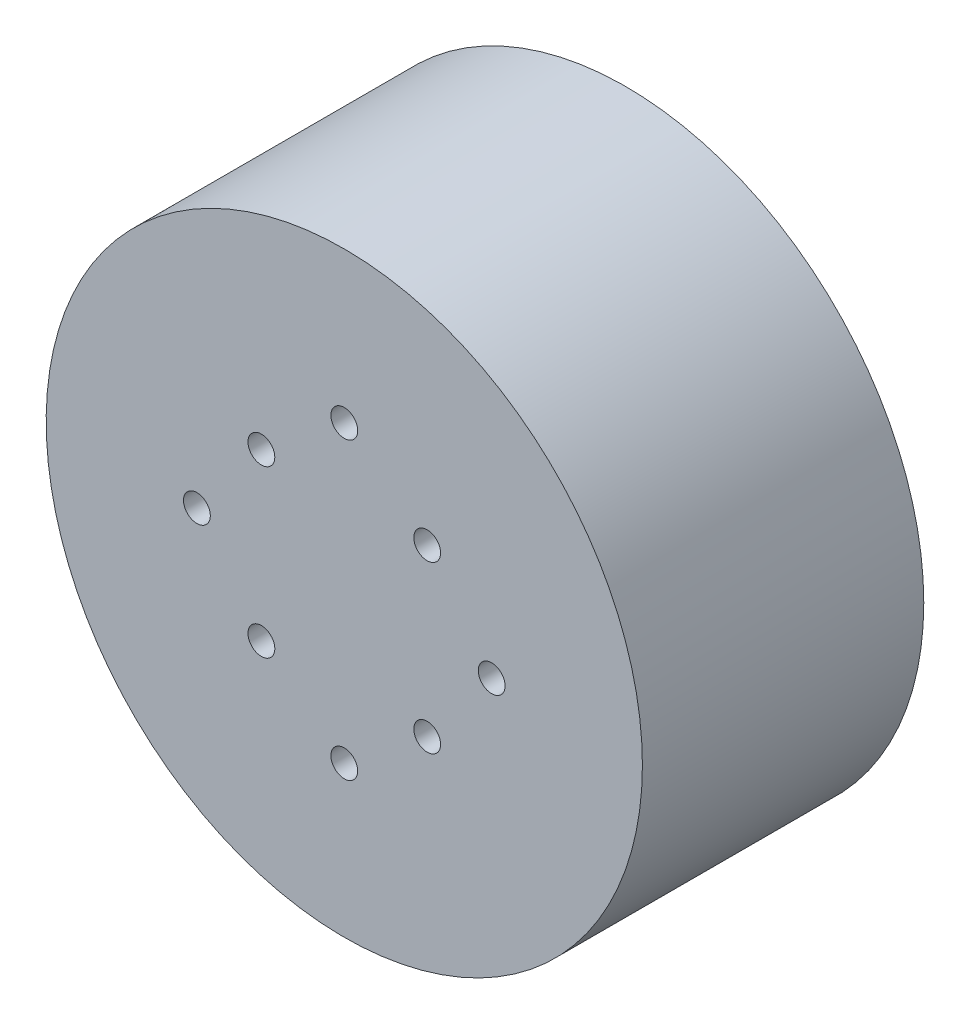
ISO-10303-21;
HEADER;
FILE_DESCRIPTION(('STEP AP214'),'2;1');
FILE_NAME('part.step','',(''),(''),'','','');
FILE_SCHEMA(('AUTOMOTIVE_DESIGN { 1 0 10303 214 1 1 1 1 }'));
ENDSEC;
DATA;
#1=APPLICATION_CONTEXT('core data for automotive mechanical design processes');
#2=APPLICATION_PROTOCOL_DEFINITION('international standard','automotive_design',2000,#1);
#3=PRODUCT_CONTEXT('',#1,'mechanical');
#4=PRODUCT('Part','Part','',(#3));
#5=PRODUCT_RELATED_PRODUCT_CATEGORY('part','',(#4));
#6=PRODUCT_DEFINITION_FORMATION('','',#4);
#7=PRODUCT_DEFINITION_CONTEXT('part definition',#1,'design');
#8=PRODUCT_DEFINITION('design','',#6,#7);
#9=PRODUCT_DEFINITION_SHAPE('','',#8);
#10=(LENGTH_UNIT() NAMED_UNIT(*) SI_UNIT(.MILLI.,.METRE.));
#11=(NAMED_UNIT(*) PLANE_ANGLE_UNIT() SI_UNIT($,.RADIAN.));
#12=(NAMED_UNIT(*) SI_UNIT($,.STERADIAN.) SOLID_ANGLE_UNIT());
#13=UNCERTAINTY_MEASURE_WITH_UNIT(LENGTH_MEASURE(1.E-05),#10,'distance_accuracy_value','');
#14=(GEOMETRIC_REPRESENTATION_CONTEXT(3) GLOBAL_UNCERTAINTY_ASSIGNED_CONTEXT((#13)) GLOBAL_UNIT_ASSIGNED_CONTEXT((#10,
#11,#12)) REPRESENTATION_CONTEXT('',''));
#15=CARTESIAN_POINT('',(0.,0.,0.));
#16=DIRECTION('',(0.,0.,1.));
#17=DIRECTION('',(1.,0.,0.));
#18=AXIS2_PLACEMENT_3D('',#15,#16,#17);
#19=CARTESIAN_POINT('',(0.,0.,42.));
#20=DIRECTION('',(0.,0.,-1.));
#21=DIRECTION('',(-1.,0.,0.));
#22=AXIS2_PLACEMENT_3D('',#19,#20,#21);
#23=CYLINDRICAL_SURFACE('',#22,44.5);
#24=CARTESIAN_POINT('',(0.,0.,42.));
#25=DIRECTION('',(0.,0.,1.));
#26=DIRECTION('',(1.,0.,0.));
#27=AXIS2_PLACEMENT_3D('',#24,#25,#26);
#28=CIRCLE('',#27,44.5);
#29=CARTESIAN_POINT('',(44.5,0.,42.));
#30=VERTEX_POINT('',#29);
#31=EDGE_CURVE('E223',#30,#30,#28,.T.);
#32=ORIENTED_EDGE('',*,*,#31,.F.);
#33=EDGE_LOOP('',(#32));
#34=FACE_BOUND('',#33,.T.);
#35=CARTESIAN_POINT('',(0.,0.,10.));
#36=DIRECTION('',(0.,0.,1.));
#37=DIRECTION('',(1.,0.,0.));
#38=AXIS2_PLACEMENT_3D('',#35,#36,#37);
#39=CIRCLE('',#38,44.5);
#40=CARTESIAN_POINT('',(-38.5046726518453,22.3078502768473,10.));
#41=VERTEX_POINT('',#40);
#42=CARTESIAN_POINT('',(-38.5046726518453,-22.3078502768473,10.));
#43=VERTEX_POINT('',#42);
#44=EDGE_CURVE('E11',#41,#43,#39,.T.);
#45=ORIENTED_EDGE('',*,*,#44,.T.);
#46=DIRECTION('',(0.,0.,-1.));
#47=VECTOR('',#46,1.);
#48=CARTESIAN_POINT('',(-38.5046726518453,-22.3078502768473,42.));
#49=LINE('',#48,#47);
#50=CARTESIAN_POINT('',(-38.5046726518453,-22.3078502768473,0.));
#51=VERTEX_POINT('',#50);
#52=EDGE_CURVE('E147',#43,#51,#49,.T.);
#53=ORIENTED_EDGE('',*,*,#52,.T.);
#54=CARTESIAN_POINT('',(0.,0.,0.));
#55=DIRECTION('',(0.,0.,1.));
#56=DIRECTION('',(1.,0.,0.));
#57=AXIS2_PLACEMENT_3D('',#54,#55,#56);
#58=CIRCLE('',#57,44.5);
#59=CARTESIAN_POINT('',(-38.5046726518453,22.3078502768473,0.));
#60=VERTEX_POINT('',#59);
#61=EDGE_CURVE('E222',#51,#60,#58,.T.);
#62=ORIENTED_EDGE('',*,*,#61,.T.);
#63=DIRECTION('',(0.,0.,-1.));
#64=VECTOR('',#63,1.);
#65=CARTESIAN_POINT('',(-38.5046726518453,22.3078502768473,42.));
#66=LINE('',#65,#64);
#67=EDGE_CURVE('E62',#60,#41,#66,.F.);
#68=ORIENTED_EDGE('',*,*,#67,.T.);
#69=EDGE_LOOP('',(#45,#53,#62,#68));
#70=FACE_BOUND('',#69,.T.);
#71=ADVANCED_FACE('F40',(#34,#70),#23,.T.);
#72=CARTESIAN_POINT('',(0.,0.,42.));
#73=DIRECTION('',(0.,0.,1.));
#74=DIRECTION('',(1.,0.,0.));
#75=AXIS2_PLACEMENT_3D('',#72,#73,#74);
#76=PLANE('',#75);
#77=CARTESIAN_POINT('',(22.,0.,42.));
#78=DIRECTION('',(0.,0.,1.));
#79=DIRECTION('',(0.,-1.,0.));
#80=AXIS2_PLACEMENT_3D('',#77,#78,#79);
#81=CIRCLE('',#80,2.);
#82=CARTESIAN_POINT('',(22.,-2.00000000000008,42.));
#83=VERTEX_POINT('',#82);
#84=EDGE_CURVE('E155',#83,#83,#81,.T.);
#85=ORIENTED_EDGE('',*,*,#84,.F.);
#86=EDGE_LOOP('',(#85));
#87=FACE_BOUND('',#86,.T.);
#88=CARTESIAN_POINT('',(12.3743686707645,-12.3743686707646,42.));
#89=DIRECTION('',(0.,0.,1.));
#90=DIRECTION('',(0.,-1.,0.));
#91=AXIS2_PLACEMENT_3D('',#88,#89,#90);
#92=CIRCLE('',#91,2.);
#93=CARTESIAN_POINT('',(12.3743686707645,-14.3743686707646,42.));
#94=VERTEX_POINT('',#93);
#95=EDGE_CURVE('E161',#94,#94,#92,.T.);
#96=ORIENTED_EDGE('',*,*,#95,.F.);
#97=EDGE_LOOP('',(#96));
#98=FACE_BOUND('',#97,.T.);
#99=CARTESIAN_POINT('',(0.,-22.,42.));
#100=DIRECTION('',(0.,0.,1.));
#101=DIRECTION('',(-1.,0.,0.));
#102=AXIS2_PLACEMENT_3D('',#99,#100,#101);
#103=CIRCLE('',#102,2.);
#104=CARTESIAN_POINT('',(-2.,-22.,42.));
#105=VERTEX_POINT('',#104);
#106=EDGE_CURVE('E167',#105,#105,#103,.T.);
#107=ORIENTED_EDGE('',*,*,#106,.F.);
#108=EDGE_LOOP('',(#107));
#109=FACE_BOUND('',#108,.T.);
#110=CARTESIAN_POINT('',(-12.3743686707646,-12.3743686707646,42.));
#111=DIRECTION('',(0.,0.,1.));
#112=DIRECTION('',(-1.,0.,0.));
#113=AXIS2_PLACEMENT_3D('',#110,#111,#112);
#114=CIRCLE('',#113,2.);
#115=CARTESIAN_POINT('',(-14.3743686707646,-12.3743686707646,42.));
#116=VERTEX_POINT('',#115);
#117=EDGE_CURVE('E173',#116,#116,#114,.T.);
#118=ORIENTED_EDGE('',*,*,#117,.F.);
#119=EDGE_LOOP('',(#118));
#120=FACE_BOUND('',#119,.T.);
#121=CARTESIAN_POINT('',(-22.,2.30437768363647E-13,42.));
#122=DIRECTION('',(0.,0.,1.));
#123=DIRECTION('',(0.,1.,0.));
#124=AXIS2_PLACEMENT_3D('',#121,#122,#123);
#125=CIRCLE('',#124,2.);
#126=CARTESIAN_POINT('',(-22.,2.00000000000023,42.));
#127=VERTEX_POINT('',#126);
#128=EDGE_CURVE('E179',#127,#127,#125,.T.);
#129=ORIENTED_EDGE('',*,*,#128,.F.);
#130=EDGE_LOOP('',(#129));
#131=FACE_BOUND('',#130,.T.);
#132=CARTESIAN_POINT('',(-12.3743686707644,12.3743686707647,42.));
#133=DIRECTION('',(0.,0.,1.));
#134=DIRECTION('',(0.,1.,0.));
#135=AXIS2_PLACEMENT_3D('',#132,#133,#134);
#136=CIRCLE('',#135,2.);
#137=CARTESIAN_POINT('',(-12.3743686707644,14.3743686707647,42.));
#138=VERTEX_POINT('',#137);
#139=EDGE_CURVE('E150',#138,#138,#136,.T.);
#140=ORIENTED_EDGE('',*,*,#139,.F.);
#141=EDGE_LOOP('',(#140));
#142=FACE_BOUND('',#141,.T.);
#143=CARTESIAN_POINT('',(0.,22.,42.));
#144=DIRECTION('',(0.,0.,1.));
#145=DIRECTION('',(1.,0.,0.));
#146=AXIS2_PLACEMENT_3D('',#143,#144,#145);
#147=CIRCLE('',#146,2.);
#148=CARTESIAN_POINT('',(2.,22.,42.));
#149=VERTEX_POINT('',#148);
#150=EDGE_CURVE('E191',#149,#149,#147,.T.);
#151=ORIENTED_EDGE('',*,*,#150,.F.);
#152=EDGE_LOOP('',(#151));
#153=FACE_BOUND('',#152,.T.);
#154=CARTESIAN_POINT('',(12.3743686707646,12.3743686707646,42.));
#155=DIRECTION('',(0.,0.,1.));
#156=DIRECTION('',(1.,0.,0.));
#157=AXIS2_PLACEMENT_3D('',#154,#155,#156);
#158=CIRCLE('',#157,2.);
#159=CARTESIAN_POINT('',(14.3743686707646,12.3743686707646,42.));
#160=VERTEX_POINT('',#159);
#161=EDGE_CURVE('E154',#160,#160,#158,.T.);
#162=ORIENTED_EDGE('',*,*,#161,.F.);
#163=EDGE_LOOP('',(#162));
#164=FACE_BOUND('',#163,.T.);
#165=ORIENTED_EDGE('',*,*,#31,.T.);
#166=EDGE_LOOP('',(#165));
#167=FACE_BOUND('',#166,.T.);
#168=ADVANCED_FACE('F248',(#87,#98,#109,#120,#131,#142,#153,#164,#167),#76,.T.);
#169=CARTESIAN_POINT('',(0.,0.,0.));
#170=DIRECTION('',(0.,0.,1.));
#171=DIRECTION('',(1.,0.,0.));
#172=AXIS2_PLACEMENT_3D('',#169,#170,#171);
#173=PLANE('',#172);
#174=CARTESIAN_POINT('',(15.,15.,0.));
#175=DIRECTION('',(0.,0.,-1.));
#176=DIRECTION('',(-1.,0.,0.));
#177=AXIS2_PLACEMENT_3D('',#174,#175,#176);
#178=CIRCLE('',#177,1.64999999999999);
#179=CARTESIAN_POINT('',(13.35,15.,0.));
#180=VERTEX_POINT('',#179);
#181=EDGE_CURVE('E190',#180,#180,#178,.T.);
#182=ORIENTED_EDGE('',*,*,#181,.F.);
#183=EDGE_LOOP('',(#182));
#184=FACE_BOUND('',#183,.T.);
#185=CARTESIAN_POINT('',(-15.,15.,0.));
#186=DIRECTION('',(0.,0.,-1.));
#187=DIRECTION('',(-1.,0.,0.));
#188=AXIS2_PLACEMENT_3D('',#185,#186,#187);
#189=CIRCLE('',#188,1.64999999999999);
#190=CARTESIAN_POINT('',(-16.65,15.,0.));
#191=VERTEX_POINT('',#190);
#192=EDGE_CURVE('E204',#191,#191,#189,.T.);
#193=ORIENTED_EDGE('',*,*,#192,.F.);
#194=EDGE_LOOP('',(#193));
#195=FACE_BOUND('',#194,.T.);
#196=CARTESIAN_POINT('',(-15.,-15.,0.));
#197=DIRECTION('',(0.,0.,-1.));
#198=DIRECTION('',(-1.,0.,0.));
#199=AXIS2_PLACEMENT_3D('',#196,#197,#198);
#200=CIRCLE('',#199,1.64999999999999);
#201=CARTESIAN_POINT('',(-16.65,-15.,0.));
#202=VERTEX_POINT('',#201);
#203=EDGE_CURVE('E210',#202,#202,#200,.T.);
#204=ORIENTED_EDGE('',*,*,#203,.F.);
#205=EDGE_LOOP('',(#204));
#206=FACE_BOUND('',#205,.T.);
#207=CARTESIAN_POINT('',(15.,-15.,0.));
#208=DIRECTION('',(0.,0.,-1.));
#209=DIRECTION('',(-1.,0.,0.));
#210=AXIS2_PLACEMENT_3D('',#207,#208,#209);
#211=CIRCLE('',#210,1.64999999999999);
#212=CARTESIAN_POINT('',(13.35,-15.,0.));
#213=VERTEX_POINT('',#212);
#214=EDGE_CURVE('E216',#213,#213,#211,.T.);
#215=ORIENTED_EDGE('',*,*,#214,.F.);
#216=EDGE_LOOP('',(#215));
#217=FACE_BOUND('',#216,.T.);
#218=ORIENTED_EDGE('',*,*,#61,.F.);
#219=DIRECTION('',(0.,1.,0.));
#220=VECTOR('',#219,1.);
#221=CARTESIAN_POINT('',(-38.5046726518453,0.,0.));
#222=LINE('',#221,#220);
#223=EDGE_CURVE('E47',#51,#60,#222,.T.);
#224=ORIENTED_EDGE('',*,*,#223,.T.);
#225=EDGE_LOOP('',(#218,#224));
#226=FACE_BOUND('',#225,.T.);
#227=ADVANCED_FACE('F229',(#184,#195,#206,#217,#226),#173,.F.);
#228=CARTESIAN_POINT('',(15.,-15.,12.));
#229=DIRECTION('',(0.,0.,-1.));
#230=DIRECTION('',(-1.,0.,0.));
#231=AXIS2_PLACEMENT_3D('',#228,#229,#230);
#232=CONICAL_SURFACE('',#231,1.64999999999999,1.02974425867665);
#233=CARTESIAN_POINT('',(15.,-15.,12.9914200213955));
#234=VERTEX_POINT('',#233);
#235=VERTEX_LOOP('',#234);
#236=FACE_BOUND('',#235,.T.);
#237=CARTESIAN_POINT('',(15.,-15.,12.));
#238=DIRECTION('',(0.,0.,-1.));
#239=DIRECTION('',(-1.,0.,0.));
#240=AXIS2_PLACEMENT_3D('',#237,#238,#239);
#241=CIRCLE('',#240,1.64999999999999);
#242=CARTESIAN_POINT('',(13.35,-15.,12.));
#243=VERTEX_POINT('',#242);
#244=EDGE_CURVE('E219',#243,#243,#241,.T.);
#245=ORIENTED_EDGE('',*,*,#244,.T.);
#246=EDGE_LOOP('',(#245));
#247=FACE_BOUND('',#246,.T.);
#248=ADVANCED_FACE('F260',(#236,#247),#232,.F.);
#249=CARTESIAN_POINT('',(15.,-15.,0.));
#250=DIRECTION('',(0.,0.,-1.));
#251=DIRECTION('',(-1.,0.,0.));
#252=AXIS2_PLACEMENT_3D('',#249,#250,#251);
#253=CYLINDRICAL_SURFACE('',#252,1.64999999999999);
#254=ORIENTED_EDGE('',*,*,#244,.F.);
#255=EDGE_LOOP('',(#254));
#256=FACE_BOUND('',#255,.T.);
#257=ORIENTED_EDGE('',*,*,#214,.T.);
#258=EDGE_LOOP('',(#257));
#259=FACE_BOUND('',#258,.T.);
#260=ADVANCED_FACE('F267',(#256,#259),#253,.F.);
#261=CARTESIAN_POINT('',(-15.,-15.,12.));
#262=DIRECTION('',(0.,0.,-1.));
#263=DIRECTION('',(-1.,0.,0.));
#264=AXIS2_PLACEMENT_3D('',#261,#262,#263);
#265=CONICAL_SURFACE('',#264,1.64999999999999,1.02974425867665);
#266=CARTESIAN_POINT('',(-15.,-15.,12.9914200213955));
#267=VERTEX_POINT('',#266);
#268=VERTEX_LOOP('',#267);
#269=FACE_BOUND('',#268,.T.);
#270=CARTESIAN_POINT('',(-15.,-15.,12.));
#271=DIRECTION('',(0.,0.,-1.));
#272=DIRECTION('',(-1.,0.,0.));
#273=AXIS2_PLACEMENT_3D('',#270,#271,#272);
#274=CIRCLE('',#273,1.64999999999999);
#275=CARTESIAN_POINT('',(-16.65,-15.,12.));
#276=VERTEX_POINT('',#275);
#277=EDGE_CURVE('E213',#276,#276,#274,.T.);
#278=ORIENTED_EDGE('',*,*,#277,.T.);
#279=EDGE_LOOP('',(#278));
#280=FACE_BOUND('',#279,.T.);
#281=ADVANCED_FACE('F271',(#269,#280),#265,.F.);
#282=CARTESIAN_POINT('',(-15.,-15.,0.));
#283=DIRECTION('',(0.,0.,-1.));
#284=DIRECTION('',(-1.,0.,0.));
#285=AXIS2_PLACEMENT_3D('',#282,#283,#284);
#286=CYLINDRICAL_SURFACE('',#285,1.64999999999999);
#287=ORIENTED_EDGE('',*,*,#277,.F.);
#288=EDGE_LOOP('',(#287));
#289=FACE_BOUND('',#288,.T.);
#290=ORIENTED_EDGE('',*,*,#203,.T.);
#291=EDGE_LOOP('',(#290));
#292=FACE_BOUND('',#291,.T.);
#293=ADVANCED_FACE('F275',(#289,#292),#286,.F.);
#294=CARTESIAN_POINT('',(-15.,15.,12.));
#295=DIRECTION('',(0.,0.,-1.));
#296=DIRECTION('',(-1.,0.,0.));
#297=AXIS2_PLACEMENT_3D('',#294,#295,#296);
#298=CONICAL_SURFACE('',#297,1.64999999999999,1.02974425867665);
#299=CARTESIAN_POINT('',(-15.,15.,12.9914200213955));
#300=VERTEX_POINT('',#299);
#301=VERTEX_LOOP('',#300);
#302=FACE_BOUND('',#301,.T.);
#303=CARTESIAN_POINT('',(-15.,15.,12.));
#304=DIRECTION('',(0.,0.,-1.));
#305=DIRECTION('',(-1.,0.,0.));
#306=AXIS2_PLACEMENT_3D('',#303,#304,#305);
#307=CIRCLE('',#306,1.64999999999999);
#308=CARTESIAN_POINT('',(-16.65,15.,12.));
#309=VERTEX_POINT('',#308);
#310=EDGE_CURVE('E207',#309,#309,#307,.T.);
#311=ORIENTED_EDGE('',*,*,#310,.T.);
#312=EDGE_LOOP('',(#311));
#313=FACE_BOUND('',#312,.T.);
#314=ADVANCED_FACE('F279',(#302,#313),#298,.F.);
#315=CARTESIAN_POINT('',(-15.,15.,0.));
#316=DIRECTION('',(0.,0.,-1.));
#317=DIRECTION('',(-1.,0.,0.));
#318=AXIS2_PLACEMENT_3D('',#315,#316,#317);
#319=CYLINDRICAL_SURFACE('',#318,1.64999999999999);
#320=ORIENTED_EDGE('',*,*,#310,.F.);
#321=EDGE_LOOP('',(#320));
#322=FACE_BOUND('',#321,.T.);
#323=ORIENTED_EDGE('',*,*,#192,.T.);
#324=EDGE_LOOP('',(#323));
#325=FACE_BOUND('',#324,.T.);
#326=ADVANCED_FACE('F283',(#322,#325),#319,.F.);
#327=CARTESIAN_POINT('',(15.,15.,12.));
#328=DIRECTION('',(0.,0.,-1.));
#329=DIRECTION('',(-1.,0.,0.));
#330=AXIS2_PLACEMENT_3D('',#327,#328,#329);
#331=CONICAL_SURFACE('',#330,1.64999999999999,1.02974425867665);
#332=CARTESIAN_POINT('',(15.,15.,12.9914200213955));
#333=VERTEX_POINT('',#332);
#334=VERTEX_LOOP('',#333);
#335=FACE_BOUND('',#334,.T.);
#336=CARTESIAN_POINT('',(15.,15.,12.));
#337=DIRECTION('',(0.,0.,-1.));
#338=DIRECTION('',(-1.,0.,0.));
#339=AXIS2_PLACEMENT_3D('',#336,#337,#338);
#340=CIRCLE('',#339,1.64999999999999);
#341=CARTESIAN_POINT('',(13.35,15.,12.));
#342=VERTEX_POINT('',#341);
#343=EDGE_CURVE('E201',#342,#342,#340,.T.);
#344=ORIENTED_EDGE('',*,*,#343,.T.);
#345=EDGE_LOOP('',(#344));
#346=FACE_BOUND('',#345,.T.);
#347=ADVANCED_FACE('F287',(#335,#346),#331,.F.);
#348=CARTESIAN_POINT('',(15.,15.,0.));
#349=DIRECTION('',(0.,0.,-1.));
#350=DIRECTION('',(-1.,0.,0.));
#351=AXIS2_PLACEMENT_3D('',#348,#349,#350);
#352=CYLINDRICAL_SURFACE('',#351,1.64999999999999);
#353=ORIENTED_EDGE('',*,*,#343,.F.);
#354=EDGE_LOOP('',(#353));
#355=FACE_BOUND('',#354,.T.);
#356=ORIENTED_EDGE('',*,*,#181,.T.);
#357=EDGE_LOOP('',(#356));
#358=FACE_BOUND('',#357,.T.);
#359=ADVANCED_FACE('F291',(#355,#358),#352,.F.);
#360=CARTESIAN_POINT('',(12.3743686707646,12.3743686707646,32.));
#361=DIRECTION('',(0.,0.,1.));
#362=DIRECTION('',(1.,0.,0.));
#363=AXIS2_PLACEMENT_3D('',#360,#361,#362);
#364=CYLINDRICAL_SURFACE('',#363,2.);
#365=CARTESIAN_POINT('',(12.3743686707646,12.3743686707646,32.));
#366=DIRECTION('',(0.,0.,1.));
#367=DIRECTION('',(1.,0.,0.));
#368=AXIS2_PLACEMENT_3D('',#365,#366,#367);
#369=CIRCLE('',#368,2.);
#370=CARTESIAN_POINT('',(14.3743686707646,12.3743686707646,32.));
#371=VERTEX_POINT('',#370);
#372=EDGE_CURVE('E194',#371,#371,#369,.T.);
#373=ORIENTED_EDGE('',*,*,#372,.F.);
#374=EDGE_LOOP('',(#373));
#375=FACE_BOUND('',#374,.T.);
#376=ORIENTED_EDGE('',*,*,#161,.T.);
#377=EDGE_LOOP('',(#376));
#378=FACE_BOUND('',#377,.T.);
#379=ADVANCED_FACE('F295',(#375,#378),#364,.F.);
#380=CARTESIAN_POINT('',(12.3743686707646,12.3743686707646,32.));
#381=DIRECTION('',(0.,0.,1.));
#382=DIRECTION('',(1.,0.,0.));
#383=AXIS2_PLACEMENT_3D('',#380,#381,#382);
#384=PLANE('',#383);
#385=ORIENTED_EDGE('',*,*,#372,.T.);
#386=EDGE_LOOP('',(#385));
#387=FACE_BOUND('',#386,.T.);
#388=ADVANCED_FACE('F299',(#387),#384,.T.);
#389=CARTESIAN_POINT('',(0.,22.,32.));
#390=DIRECTION('',(0.,0.,1.));
#391=DIRECTION('',(1.,0.,0.));
#392=AXIS2_PLACEMENT_3D('',#389,#390,#391);
#393=CYLINDRICAL_SURFACE('',#392,2.);
#394=CARTESIAN_POINT('',(0.,22.,32.));
#395=DIRECTION('',(0.,0.,1.));
#396=DIRECTION('',(1.,0.,0.));
#397=AXIS2_PLACEMENT_3D('',#394,#395,#396);
#398=CIRCLE('',#397,2.);
#399=CARTESIAN_POINT('',(2.,22.,32.));
#400=VERTEX_POINT('',#399);
#401=EDGE_CURVE('E187',#400,#400,#398,.T.);
#402=ORIENTED_EDGE('',*,*,#401,.F.);
#403=EDGE_LOOP('',(#402));
#404=FACE_BOUND('',#403,.T.);
#405=ORIENTED_EDGE('',*,*,#150,.T.);
#406=EDGE_LOOP('',(#405));
#407=FACE_BOUND('',#406,.T.);
#408=ADVANCED_FACE('F303',(#404,#407),#393,.F.);
#409=CARTESIAN_POINT('',(0.,22.,32.));
#410=DIRECTION('',(0.,0.,1.));
#411=DIRECTION('',(1.,0.,0.));
#412=AXIS2_PLACEMENT_3D('',#409,#410,#411);
#413=PLANE('',#412);
#414=ORIENTED_EDGE('',*,*,#401,.T.);
#415=EDGE_LOOP('',(#414));
#416=FACE_BOUND('',#415,.T.);
#417=ADVANCED_FACE('F307',(#416),#413,.T.);
#418=CARTESIAN_POINT('',(-12.3743686707644,12.3743686707647,32.));
#419=DIRECTION('',(0.,0.,1.));
#420=DIRECTION('',(1.,0.,0.));
#421=AXIS2_PLACEMENT_3D('',#418,#419,#420);
#422=CYLINDRICAL_SURFACE('',#421,2.);
#423=CARTESIAN_POINT('',(-12.3743686707644,12.3743686707647,32.));
#424=DIRECTION('',(0.,0.,1.));
#425=DIRECTION('',(0.,1.,0.));
#426=AXIS2_PLACEMENT_3D('',#423,#424,#425);
#427=CIRCLE('',#426,2.);
#428=CARTESIAN_POINT('',(-12.3743686707644,14.3743686707647,32.));
#429=VERTEX_POINT('',#428);
#430=EDGE_CURVE('E182',#429,#429,#427,.T.);
#431=ORIENTED_EDGE('',*,*,#430,.F.);
#432=EDGE_LOOP('',(#431));
#433=FACE_BOUND('',#432,.T.);
#434=ORIENTED_EDGE('',*,*,#139,.T.);
#435=EDGE_LOOP('',(#434));
#436=FACE_BOUND('',#435,.T.);
#437=ADVANCED_FACE('F311',(#433,#436),#422,.F.);
#438=CARTESIAN_POINT('',(-12.3743686707644,12.3743686707647,32.));
#439=DIRECTION('',(0.,0.,1.));
#440=DIRECTION('',(0.,1.,0.));
#441=AXIS2_PLACEMENT_3D('',#438,#439,#440);
#442=PLANE('',#441);
#443=ORIENTED_EDGE('',*,*,#430,.T.);
#444=EDGE_LOOP('',(#443));
#445=FACE_BOUND('',#444,.T.);
#446=ADVANCED_FACE('F315',(#445),#442,.T.);
#447=CARTESIAN_POINT('',(-22.,2.30437768363647E-13,32.));
#448=DIRECTION('',(0.,0.,1.));
#449=DIRECTION('',(1.,0.,0.));
#450=AXIS2_PLACEMENT_3D('',#447,#448,#449);
#451=CYLINDRICAL_SURFACE('',#450,2.);
#452=CARTESIAN_POINT('',(-22.,2.30437768363647E-13,32.));
#453=DIRECTION('',(0.,0.,1.));
#454=DIRECTION('',(0.,1.,0.));
#455=AXIS2_PLACEMENT_3D('',#452,#453,#454);
#456=CIRCLE('',#455,2.);
#457=CARTESIAN_POINT('',(-22.,2.00000000000023,32.));
#458=VERTEX_POINT('',#457);
#459=EDGE_CURVE('E176',#458,#458,#456,.T.);
#460=ORIENTED_EDGE('',*,*,#459,.F.);
#461=EDGE_LOOP('',(#460));
#462=FACE_BOUND('',#461,.T.);
#463=ORIENTED_EDGE('',*,*,#128,.T.);
#464=EDGE_LOOP('',(#463));
#465=FACE_BOUND('',#464,.T.);
#466=ADVANCED_FACE('F319',(#462,#465),#451,.F.);
#467=CARTESIAN_POINT('',(-22.,2.30437768363647E-13,32.));
#468=DIRECTION('',(0.,0.,1.));
#469=DIRECTION('',(0.,1.,0.));
#470=AXIS2_PLACEMENT_3D('',#467,#468,#469);
#471=PLANE('',#470);
#472=ORIENTED_EDGE('',*,*,#459,.T.);
#473=EDGE_LOOP('',(#472));
#474=FACE_BOUND('',#473,.T.);
#475=ADVANCED_FACE('F323',(#474),#471,.T.);
#476=CARTESIAN_POINT('',(-12.3743686707646,-12.3743686707646,32.));
#477=DIRECTION('',(0.,0.,1.));
#478=DIRECTION('',(1.,0.,0.));
#479=AXIS2_PLACEMENT_3D('',#476,#477,#478);
#480=CYLINDRICAL_SURFACE('',#479,2.);
#481=CARTESIAN_POINT('',(-12.3743686707646,-12.3743686707646,32.));
#482=DIRECTION('',(0.,0.,1.));
#483=DIRECTION('',(-1.,0.,0.));
#484=AXIS2_PLACEMENT_3D('',#481,#482,#483);
#485=CIRCLE('',#484,2.);
#486=CARTESIAN_POINT('',(-14.3743686707646,-12.3743686707646,32.));
#487=VERTEX_POINT('',#486);
#488=EDGE_CURVE('E170',#487,#487,#485,.T.);
#489=ORIENTED_EDGE('',*,*,#488,.F.);
#490=EDGE_LOOP('',(#489));
#491=FACE_BOUND('',#490,.T.);
#492=ORIENTED_EDGE('',*,*,#117,.T.);
#493=EDGE_LOOP('',(#492));
#494=FACE_BOUND('',#493,.T.);
#495=ADVANCED_FACE('F327',(#491,#494),#480,.F.);
#496=CARTESIAN_POINT('',(-12.3743686707646,-12.3743686707646,32.));
#497=DIRECTION('',(0.,0.,1.));
#498=DIRECTION('',(-1.,0.,0.));
#499=AXIS2_PLACEMENT_3D('',#496,#497,#498);
#500=PLANE('',#499);
#501=ORIENTED_EDGE('',*,*,#488,.T.);
#502=EDGE_LOOP('',(#501));
#503=FACE_BOUND('',#502,.T.);
#504=ADVANCED_FACE('F331',(#503),#500,.T.);
#505=CARTESIAN_POINT('',(0.,-22.,32.));
#506=DIRECTION('',(0.,0.,1.));
#507=DIRECTION('',(1.,0.,0.));
#508=AXIS2_PLACEMENT_3D('',#505,#506,#507);
#509=CYLINDRICAL_SURFACE('',#508,2.);
#510=CARTESIAN_POINT('',(0.,-22.,32.));
#511=DIRECTION('',(0.,0.,1.));
#512=DIRECTION('',(-1.,0.,0.));
#513=AXIS2_PLACEMENT_3D('',#510,#511,#512);
#514=CIRCLE('',#513,2.);
#515=CARTESIAN_POINT('',(-2.,-22.,32.));
#516=VERTEX_POINT('',#515);
#517=EDGE_CURVE('E164',#516,#516,#514,.T.);
#518=ORIENTED_EDGE('',*,*,#517,.F.);
#519=EDGE_LOOP('',(#518));
#520=FACE_BOUND('',#519,.T.);
#521=ORIENTED_EDGE('',*,*,#106,.T.);
#522=EDGE_LOOP('',(#521));
#523=FACE_BOUND('',#522,.T.);
#524=ADVANCED_FACE('F335',(#520,#523),#509,.F.);
#525=CARTESIAN_POINT('',(0.,-22.,32.));
#526=DIRECTION('',(0.,0.,1.));
#527=DIRECTION('',(-1.,0.,0.));
#528=AXIS2_PLACEMENT_3D('',#525,#526,#527);
#529=PLANE('',#528);
#530=ORIENTED_EDGE('',*,*,#517,.T.);
#531=EDGE_LOOP('',(#530));
#532=FACE_BOUND('',#531,.T.);
#533=ADVANCED_FACE('F339',(#532),#529,.T.);
#534=CARTESIAN_POINT('',(12.3743686707645,-12.3743686707646,32.));
#535=DIRECTION('',(0.,0.,1.));
#536=DIRECTION('',(1.,0.,0.));
#537=AXIS2_PLACEMENT_3D('',#534,#535,#536);
#538=CYLINDRICAL_SURFACE('',#537,2.);
#539=CARTESIAN_POINT('',(12.3743686707645,-12.3743686707646,32.));
#540=DIRECTION('',(0.,0.,1.));
#541=DIRECTION('',(0.,-1.,0.));
#542=AXIS2_PLACEMENT_3D('',#539,#540,#541);
#543=CIRCLE('',#542,2.);
#544=CARTESIAN_POINT('',(12.3743686707645,-14.3743686707646,32.));
#545=VERTEX_POINT('',#544);
#546=EDGE_CURVE('E158',#545,#545,#543,.T.);
#547=ORIENTED_EDGE('',*,*,#546,.F.);
#548=EDGE_LOOP('',(#547));
#549=FACE_BOUND('',#548,.T.);
#550=ORIENTED_EDGE('',*,*,#95,.T.);
#551=EDGE_LOOP('',(#550));
#552=FACE_BOUND('',#551,.T.);
#553=ADVANCED_FACE('F343',(#549,#552),#538,.F.);
#554=CARTESIAN_POINT('',(12.3743686707645,-12.3743686707646,32.));
#555=DIRECTION('',(0.,0.,1.));
#556=DIRECTION('',(0.,-1.,0.));
#557=AXIS2_PLACEMENT_3D('',#554,#555,#556);
#558=PLANE('',#557);
#559=ORIENTED_EDGE('',*,*,#546,.T.);
#560=EDGE_LOOP('',(#559));
#561=FACE_BOUND('',#560,.T.);
#562=ADVANCED_FACE('F347',(#561),#558,.T.);
#563=CARTESIAN_POINT('',(22.,0.,32.));
#564=DIRECTION('',(0.,0.,1.));
#565=DIRECTION('',(1.,0.,0.));
#566=AXIS2_PLACEMENT_3D('',#563,#564,#565);
#567=CYLINDRICAL_SURFACE('',#566,2.);
#568=CARTESIAN_POINT('',(22.,0.,32.));
#569=DIRECTION('',(0.,0.,1.));
#570=DIRECTION('',(0.,-1.,0.));
#571=AXIS2_PLACEMENT_3D('',#568,#569,#570);
#572=CIRCLE('',#571,2.);
#573=CARTESIAN_POINT('',(22.,-2.00000000000008,32.));
#574=VERTEX_POINT('',#573);
#575=EDGE_CURVE('E151',#574,#574,#572,.T.);
#576=ORIENTED_EDGE('',*,*,#575,.F.);
#577=EDGE_LOOP('',(#576));
#578=FACE_BOUND('',#577,.T.);
#579=ORIENTED_EDGE('',*,*,#84,.T.);
#580=EDGE_LOOP('',(#579));
#581=FACE_BOUND('',#580,.T.);
#582=ADVANCED_FACE('F243',(#578,#581),#567,.F.);
#583=CARTESIAN_POINT('',(22.,0.,32.));
#584=DIRECTION('',(0.,0.,1.));
#585=DIRECTION('',(0.,-1.,0.));
#586=AXIS2_PLACEMENT_3D('',#583,#584,#585);
#587=PLANE('',#586);
#588=ORIENTED_EDGE('',*,*,#575,.T.);
#589=EDGE_LOOP('',(#588));
#590=FACE_BOUND('',#589,.T.);
#591=ADVANCED_FACE('F235',(#590),#587,.T.);
#592=CARTESIAN_POINT('',(0.,0.,10.));
#593=DIRECTION('',(0.,0.,1.));
#594=DIRECTION('',(1.,0.,0.));
#595=AXIS2_PLACEMENT_3D('',#592,#593,#594);
#596=PLANE('',#595);
#597=DIRECTION('',(0.,-1.,0.));
#598=VECTOR('',#597,1.);
#599=CARTESIAN_POINT('',(-38.5046726518453,-26.0165636682029,10.));
#600=LINE('',#599,#598);
#601=EDGE_CURVE('E140',#41,#43,#600,.T.);
#602=ORIENTED_EDGE('',*,*,#601,.T.);
#603=ORIENTED_EDGE('',*,*,#44,.F.);
#604=EDGE_LOOP('',(#602,#603));
#605=FACE_BOUND('',#604,.T.);
#606=ADVANCED_FACE('F233',(#605),#596,.F.);
#607=CARTESIAN_POINT('',(-38.5046726518453,-26.0165636682029,10.));
#608=DIRECTION('',(1.,0.,0.));
#609=DIRECTION('',(0.,0.,-1.));
#610=AXIS2_PLACEMENT_3D('',#607,#608,#609);
#611=PLANE('',#610);
#612=DIRECTION('',(0.,0.,1.));
#613=VECTOR('',#612,1.);
#614=CARTESIAN_POINT('',(-38.5046726518453,-14.85322403461,2.71282307021181));
#615=LINE('',#614,#613);
#616=CARTESIAN_POINT('',(-38.5046726518453,-14.85322403461,2.71282307021181));
#617=VERTEX_POINT('',#616);
#618=CARTESIAN_POINT('',(-38.5046726518453,-14.85322403461,7.95811416438141));
#619=VERTEX_POINT('',#618);
#620=EDGE_CURVE('E134',#617,#619,#615,.T.);
#621=ORIENTED_EDGE('',*,*,#620,.F.);
#622=DIRECTION('',(0.,-1.,0.));
#623=VECTOR('',#622,1.);
#624=CARTESIAN_POINT('',(-38.5046726518453,-14.85322403461,2.71282307021181));
#625=LINE('',#624,#623);
#626=CARTESIAN_POINT('',(-38.5046726518453,14.1993245944576,2.71282307021181));
#627=VERTEX_POINT('',#626);
#628=EDGE_CURVE('E54',#627,#617,#625,.T.);
#629=ORIENTED_EDGE('',*,*,#628,.F.);
#630=DIRECTION('',(0.,0.,-1.));
#631=VECTOR('',#630,1.);
#632=CARTESIAN_POINT('',(-38.5046726518453,14.1993245944576,2.71282307021181));
#633=LINE('',#632,#631);
#634=CARTESIAN_POINT('',(-38.5046726518453,14.1993245944576,7.95811416438141));
#635=VERTEX_POINT('',#634);
#636=EDGE_CURVE('E125',#635,#627,#633,.T.);
#637=ORIENTED_EDGE('',*,*,#636,.F.);
#638=DIRECTION('',(0.,1.,0.));
#639=VECTOR('',#638,1.);
#640=CARTESIAN_POINT('',(-38.5046726518453,-14.85322403461,7.95811416438141));
#641=LINE('',#640,#639);
#642=EDGE_CURVE('E128',#619,#635,#641,.T.);
#643=ORIENTED_EDGE('',*,*,#642,.F.);
#644=EDGE_LOOP('',(#621,#629,#637,#643));
#645=FACE_BOUND('',#644,.T.);
#646=ORIENTED_EDGE('',*,*,#601,.F.);
#647=ORIENTED_EDGE('',*,*,#67,.F.);
#648=ORIENTED_EDGE('',*,*,#223,.F.);
#649=ORIENTED_EDGE('',*,*,#52,.F.);
#650=EDGE_LOOP('',(#646,#647,#648,#649));
#651=FACE_BOUND('',#650,.T.);
#652=ADVANCED_FACE('F231',(#645,#651),#611,.F.);
#653=CARTESIAN_POINT('',(-28.5046726518453,-14.85322403461,2.71282307021181));
#654=DIRECTION('',(0.,0.,-1.));
#655=DIRECTION('',(-1.,0.,0.));
#656=AXIS2_PLACEMENT_3D('',#653,#654,#655);
#657=PLANE('',#656);
#658=ORIENTED_EDGE('',*,*,#628,.T.);
#659=DIRECTION('',(-1.,0.,0.));
#660=VECTOR('',#659,1.);
#661=CARTESIAN_POINT('',(-28.5046726518453,-14.85322403461,2.71282307021181));
#662=LINE('',#661,#660);
#663=CARTESIAN_POINT('',(-28.5046726518453,-14.85322403461,2.71282307021181));
#664=VERTEX_POINT('',#663);
#665=EDGE_CURVE('E103',#664,#617,#662,.T.);
#666=ORIENTED_EDGE('',*,*,#665,.F.);
#667=DIRECTION('',(0.,-1.,0.));
#668=VECTOR('',#667,1.);
#669=CARTESIAN_POINT('',(-28.5046726518453,-14.85322403461,2.71282307021181));
#670=LINE('',#669,#668);
#671=CARTESIAN_POINT('',(-28.5046726518453,14.1993245944576,2.71282307021181));
#672=VERTEX_POINT('',#671);
#673=EDGE_CURVE('E107',#672,#664,#670,.T.);
#674=ORIENTED_EDGE('',*,*,#673,.F.);
#675=DIRECTION('',(-1.,0.,0.));
#676=VECTOR('',#675,1.);
#677=CARTESIAN_POINT('',(-28.5046726518453,14.1993245944576,2.71282307021181));
#678=LINE('',#677,#676);
#679=EDGE_CURVE('E138',#672,#627,#678,.T.);
#680=ORIENTED_EDGE('',*,*,#679,.T.);
#681=EDGE_LOOP('',(#658,#666,#674,#680));
#682=FACE_BOUND('',#681,.T.);
#683=ADVANCED_FACE('F105',(#682),#657,.F.);
#684=CARTESIAN_POINT('',(-28.5046726518453,14.1993245944576,2.71282307021181));
#685=DIRECTION('',(0.,1.,0.));
#686=DIRECTION('',(0.,0.,1.));
#687=AXIS2_PLACEMENT_3D('',#684,#685,#686);
#688=PLANE('',#687);
#689=ORIENTED_EDGE('',*,*,#636,.T.);
#690=ORIENTED_EDGE('',*,*,#679,.F.);
#691=DIRECTION('',(0.,0.,-1.));
#692=VECTOR('',#691,1.);
#693=CARTESIAN_POINT('',(-28.5046726518453,14.1993245944576,2.71282307021181));
#694=LINE('',#693,#692);
#695=CARTESIAN_POINT('',(-28.5046726518453,14.1993245944576,7.95811416438141));
#696=VERTEX_POINT('',#695);
#697=EDGE_CURVE('E113',#696,#672,#694,.T.);
#698=ORIENTED_EDGE('',*,*,#697,.F.);
#699=DIRECTION('',(-1.,0.,0.));
#700=VECTOR('',#699,1.);
#701=CARTESIAN_POINT('',(-28.5046726518453,14.1993245944576,7.95811416438141));
#702=LINE('',#701,#700);
#703=EDGE_CURVE('E141',#696,#635,#702,.T.);
#704=ORIENTED_EDGE('',*,*,#703,.T.);
#705=EDGE_LOOP('',(#689,#690,#698,#704));
#706=FACE_BOUND('',#705,.T.);
#707=ADVANCED_FACE('F395',(#706),#688,.F.);
#708=CARTESIAN_POINT('',(-28.5046726518453,-14.85322403461,7.95811416438141));
#709=DIRECTION('',(0.,0.,1.));
#710=DIRECTION('',(1.,0.,0.));
#711=AXIS2_PLACEMENT_3D('',#708,#709,#710);
#712=PLANE('',#711);
#713=ORIENTED_EDGE('',*,*,#642,.T.);
#714=ORIENTED_EDGE('',*,*,#703,.F.);
#715=DIRECTION('',(0.,1.,0.));
#716=VECTOR('',#715,1.);
#717=CARTESIAN_POINT('',(-28.5046726518453,-14.85322403461,7.95811416438141));
#718=LINE('',#717,#716);
#719=CARTESIAN_POINT('',(-28.5046726518453,-14.85322403461,7.95811416438141));
#720=VERTEX_POINT('',#719);
#721=EDGE_CURVE('E121',#720,#696,#718,.T.);
#722=ORIENTED_EDGE('',*,*,#721,.F.);
#723=DIRECTION('',(-1.,0.,0.));
#724=VECTOR('',#723,1.);
#725=CARTESIAN_POINT('',(-28.5046726518453,-14.85322403461,7.95811416438141));
#726=LINE('',#725,#724);
#727=EDGE_CURVE('E112',#720,#619,#726,.T.);
#728=ORIENTED_EDGE('',*,*,#727,.T.);
#729=EDGE_LOOP('',(#713,#714,#722,#728));
#730=FACE_BOUND('',#729,.T.);
#731=ADVANCED_FACE('F403',(#730),#712,.F.);
#732=CARTESIAN_POINT('',(-28.5046726518453,-14.85322403461,2.71282307021181));
#733=DIRECTION('',(0.,-1.,0.));
#734=DIRECTION('',(0.,0.,-1.));
#735=AXIS2_PLACEMENT_3D('',#732,#733,#734);
#736=PLANE('',#735);
#737=ORIENTED_EDGE('',*,*,#620,.T.);
#738=ORIENTED_EDGE('',*,*,#727,.F.);
#739=DIRECTION('',(0.,0.,1.));
#740=VECTOR('',#739,1.);
#741=CARTESIAN_POINT('',(-28.5046726518453,-14.85322403461,2.71282307021181));
#742=LINE('',#741,#740);
#743=EDGE_CURVE('E116',#664,#720,#742,.T.);
#744=ORIENTED_EDGE('',*,*,#743,.F.);
#745=ORIENTED_EDGE('',*,*,#665,.T.);
#746=EDGE_LOOP('',(#737,#738,#744,#745));
#747=FACE_BOUND('',#746,.T.);
#748=ADVANCED_FACE('F117',(#747),#736,.F.);
#749=CARTESIAN_POINT('',(-28.5046726518453,0.,0.));
#750=DIRECTION('',(1.,0.,0.));
#751=DIRECTION('',(0.,0.,-1.));
#752=AXIS2_PLACEMENT_3D('',#749,#750,#751);
#753=PLANE('',#752);
#754=ORIENTED_EDGE('',*,*,#673,.T.);
#755=ORIENTED_EDGE('',*,*,#743,.T.);
#756=ORIENTED_EDGE('',*,*,#721,.T.);
#757=ORIENTED_EDGE('',*,*,#697,.T.);
#758=EDGE_LOOP('',(#754,#755,#756,#757));
#759=FACE_BOUND('',#758,.T.);
#760=ADVANCED_FACE('F123',(#759),#753,.F.);
#761=CLOSED_SHELL('',(#71,#168,#227,#248,#260,#281,#293,#314,#326,#347,#359,#379,#388,#408,#417,
#437,#446,#466,#475,#495,#504,#524,#533,#553,#562,#582,#591,#606,#652,#683,#707,#731,#748,#760));
#762=MANIFOLD_SOLID_BREP('B2',#761);
#763=ADVANCED_BREP_SHAPE_REPRESENTATION('',(#18,#762),#14);
#764=SHAPE_DEFINITION_REPRESENTATION(#9,#763);
ENDSEC;
END-ISO-10303-21;
